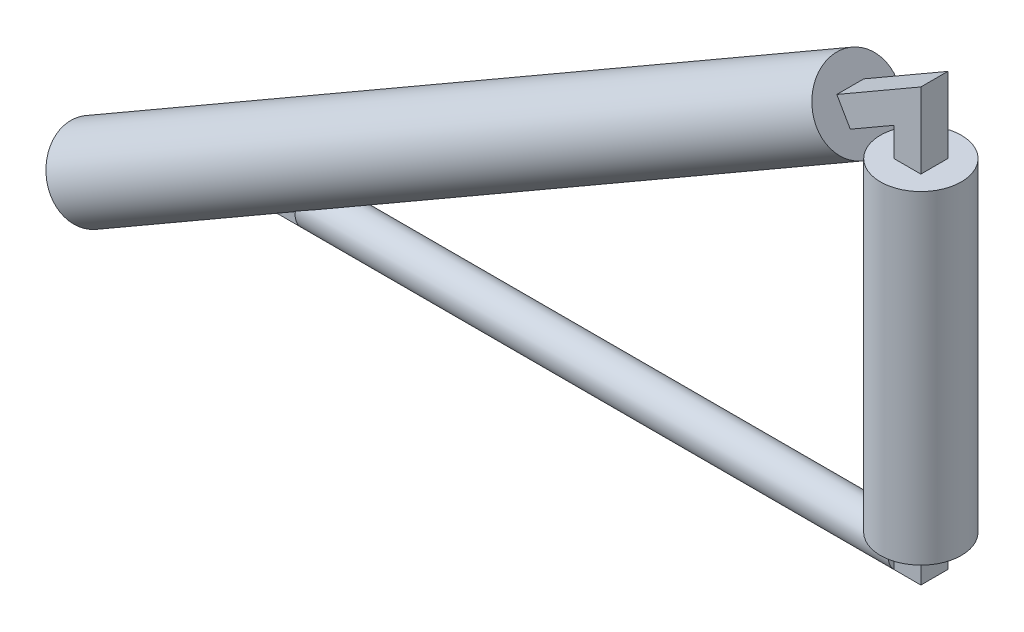
ISO-10303-21;
HEADER;
FILE_DESCRIPTION(('STEP AP214'),'2;1');
FILE_NAME('part.step','',(''),(''),'','','');
FILE_SCHEMA(('AUTOMOTIVE_DESIGN { 1 0 10303 214 1 1 1 1 }'));
ENDSEC;
DATA;
#1=APPLICATION_CONTEXT('core data for automotive mechanical design processes');
#2=APPLICATION_PROTOCOL_DEFINITION('international standard','automotive_design',2000,#1);
#3=PRODUCT_CONTEXT('',#1,'mechanical');
#4=PRODUCT('Part','Part','',(#3));
#5=PRODUCT_RELATED_PRODUCT_CATEGORY('part','',(#4));
#6=PRODUCT_DEFINITION_FORMATION('','',#4);
#7=PRODUCT_DEFINITION_CONTEXT('part definition',#1,'design');
#8=PRODUCT_DEFINITION('design','',#6,#7);
#9=PRODUCT_DEFINITION_SHAPE('','',#8);
#10=(LENGTH_UNIT() NAMED_UNIT(*) SI_UNIT(.MILLI.,.METRE.));
#11=(NAMED_UNIT(*) PLANE_ANGLE_UNIT() SI_UNIT($,.RADIAN.));
#12=(NAMED_UNIT(*) SI_UNIT($,.STERADIAN.) SOLID_ANGLE_UNIT());
#13=UNCERTAINTY_MEASURE_WITH_UNIT(LENGTH_MEASURE(1.E-05),#10,'distance_accuracy_value','');
#14=(GEOMETRIC_REPRESENTATION_CONTEXT(3) GLOBAL_UNCERTAINTY_ASSIGNED_CONTEXT((#13)) GLOBAL_UNIT_ASSIGNED_CONTEXT((#10,
#11,#12)) REPRESENTATION_CONTEXT('',''));
#15=CARTESIAN_POINT('',(0.,0.,0.));
#16=DIRECTION('',(0.,0.,1.));
#17=DIRECTION('',(1.,0.,0.));
#18=AXIS2_PLACEMENT_3D('',#15,#16,#17);
#19=CARTESIAN_POINT('',(0.,0.,3.175));
#20=DIRECTION('',(0.,0.,1.));
#21=DIRECTION('',(1.,0.,0.));
#22=AXIS2_PLACEMENT_3D('',#19,#20,#21);
#23=PLANE('',#22);
#24=DIRECTION('',(0.,-1.,0.));
#25=VECTOR('',#24,1.);
#26=CARTESIAN_POINT('',(-73.025,0.,3.175));
#27=LINE('',#26,#25);
#28=CARTESIAN_POINT('',(-73.025,1.62115619885955,3.175));
#29=VERTEX_POINT('',#28);
#30=CARTESIAN_POINT('',(-73.025,0.,3.175));
#31=VERTEX_POINT('',#30);
#32=EDGE_CURVE('E287',#29,#31,#27,.T.);
#33=ORIENTED_EDGE('',*,*,#32,.F.);
#34=DIRECTION('',(0.866025403784442,0.499999999999995,0.));
#35=VECTOR('',#34,1.);
#36=CARTESIAN_POINT('',(-97.0477418851002,-12.2483802951758,3.175));
#37=LINE('',#36,#35);
#38=CARTESIAN_POINT('',(-75.83292490343,0.,3.175));
#39=VERTEX_POINT('',#38);
#40=EDGE_CURVE('E48',#29,#39,#37,.F.);
#41=ORIENTED_EDGE('',*,*,#40,.T.);
#42=DIRECTION('',(1.,0.,0.));
#43=VECTOR('',#42,1.);
#44=CARTESIAN_POINT('',(-87.9881810244993,0.,3.175));
#45=LINE('',#44,#43);
#46=EDGE_CURVE('E267',#39,#31,#45,.T.);
#47=ORIENTED_EDGE('',*,*,#46,.T.);
#48=EDGE_LOOP('',(#33,#41,#47));
#49=FACE_BOUND('',#48,.T.);
#50=ADVANCED_FACE('F33',(#49),#23,.T.);
#51=DIRECTION('',(-0.866025403784442,-0.499999999999995,0.));
#52=VECTOR('',#51,1.);
#53=CARTESIAN_POINT('',(0.,50.7999999999995,3.175));
#54=LINE('',#53,#52);
#55=CARTESIAN_POINT('',(0.,50.7999999999995,3.175));
#56=VERTEX_POINT('',#55);
#57=CARTESIAN_POINT('',(-9.89867036525572,45.0849999999998,3.175));
#58=VERTEX_POINT('',#57);
#59=EDGE_CURVE('E249',#56,#58,#54,.T.);
#60=ORIENTED_EDGE('',*,*,#59,.T.);
#61=DIRECTION('',(0.499999999999995,-0.866025403784442,0.));
#62=VECTOR('',#61,1.);
#63=CARTESIAN_POINT('',(12.0983748908686,6.98499999999992,3.175));
#64=LINE('',#63,#62);
#65=CARTESIAN_POINT('',(-8.31117036525575,42.3353693429842,3.175));
#66=VERTEX_POINT('',#65);
#67=EDGE_CURVE('E327',#58,#66,#64,.T.);
#68=ORIENTED_EDGE('',*,*,#67,.T.);
#69=DIRECTION('',(-0.866025403784441,-0.499999999999995,0.));
#70=VECTOR('',#69,1.);
#71=CARTESIAN_POINT('',(-3.175,45.3007386859683,3.175));
#72=LINE('',#71,#70);
#73=CARTESIAN_POINT('',(-3.175,45.3007386859683,3.175));
#74=VERTEX_POINT('',#73);
#75=EDGE_CURVE('E274',#74,#66,#72,.T.);
#76=ORIENTED_EDGE('',*,*,#75,.F.);
#77=DIRECTION('',(0.,1.,0.));
#78=VECTOR('',#77,1.);
#79=CARTESIAN_POINT('',(-3.175,3.175,3.175));
#80=LINE('',#79,#78);
#81=CARTESIAN_POINT('',(-3.175,41.91,3.175));
#82=VERTEX_POINT('',#81);
#83=EDGE_CURVE('E282',#82,#74,#80,.T.);
#84=ORIENTED_EDGE('',*,*,#83,.F.);
#85=DIRECTION('',(1.,0.,0.));
#86=VECTOR('',#85,1.);
#87=CARTESIAN_POINT('',(0.,41.91,3.175));
#88=LINE('',#87,#86);
#89=CARTESIAN_POINT('',(0.,41.91,3.175));
#90=VERTEX_POINT('',#89);
#91=EDGE_CURVE('E305',#82,#90,#88,.T.);
#92=ORIENTED_EDGE('',*,*,#91,.T.);
#93=DIRECTION('',(0.,1.,0.));
#94=VECTOR('',#93,1.);
#95=CARTESIAN_POINT('',(0.,0.,3.175));
#96=LINE('',#95,#94);
#97=EDGE_CURVE('E266',#90,#56,#96,.T.);
#98=ORIENTED_EDGE('',*,*,#97,.T.);
#99=EDGE_LOOP('',(#60,#68,#76,#84,#92,#98));
#100=FACE_BOUND('',#99,.T.);
#101=ADVANCED_FACE('F356',(#100),#23,.T.);
#102=CARTESIAN_POINT('',(0.,0.,0.));
#103=DIRECTION('',(0.,0.,1.));
#104=DIRECTION('',(1.,0.,0.));
#105=AXIS2_PLACEMENT_3D('',#102,#103,#104);
#106=PLANE('',#105);
#107=DIRECTION('',(0.866025403784442,0.499999999999995,0.));
#108=VECTOR('',#107,1.);
#109=CARTESIAN_POINT('',(-97.0477418851002,-12.2483802951758,0.));
#110=LINE('',#109,#108);
#111=CARTESIAN_POINT('',(-73.025,1.62115619885955,0.));
#112=VERTEX_POINT('',#111);
#113=CARTESIAN_POINT('',(-75.83292490343,0.,0.));
#114=VERTEX_POINT('',#113);
#115=EDGE_CURVE('E173',#112,#114,#110,.F.);
#116=ORIENTED_EDGE('',*,*,#115,.F.);
#117=DIRECTION('',(0.,-1.,0.));
#118=VECTOR('',#117,1.);
#119=CARTESIAN_POINT('',(-73.025,0.,0.));
#120=LINE('',#119,#118);
#121=CARTESIAN_POINT('',(-73.025,0.,0.));
#122=VERTEX_POINT('',#121);
#123=EDGE_CURVE('E170',#112,#122,#120,.T.);
#124=ORIENTED_EDGE('',*,*,#123,.T.);
#125=DIRECTION('',(1.,0.,0.));
#126=VECTOR('',#125,1.);
#127=CARTESIAN_POINT('',(-87.9881810244993,0.,0.));
#128=LINE('',#127,#126);
#129=EDGE_CURVE('E258',#114,#122,#128,.T.);
#130=ORIENTED_EDGE('',*,*,#129,.F.);
#131=EDGE_LOOP('',(#116,#124,#130));
#132=FACE_BOUND('',#131,.T.);
#133=ADVANCED_FACE('F393',(#132),#106,.F.);
#134=DIRECTION('',(0.499999999999995,-0.866025403784442,0.));
#135=VECTOR('',#134,1.);
#136=CARTESIAN_POINT('',(12.0983748908686,6.98499999999992,0.));
#137=LINE('',#136,#135);
#138=CARTESIAN_POINT('',(-9.89867036525572,45.0849999999998,0.));
#139=VERTEX_POINT('',#138);
#140=CARTESIAN_POINT('',(-8.31117036525575,42.3353693429842,0.));
#141=VERTEX_POINT('',#140);
#142=EDGE_CURVE('E330',#139,#141,#137,.T.);
#143=ORIENTED_EDGE('',*,*,#142,.F.);
#144=DIRECTION('',(-0.866025403784442,-0.499999999999995,0.));
#145=VECTOR('',#144,1.);
#146=CARTESIAN_POINT('',(0.,50.7999999999995,0.));
#147=LINE('',#146,#145);
#148=CARTESIAN_POINT('',(0.,50.7999999999995,0.));
#149=VERTEX_POINT('',#148);
#150=EDGE_CURVE('E250',#149,#139,#147,.T.);
#151=ORIENTED_EDGE('',*,*,#150,.F.);
#152=DIRECTION('',(0.,1.,0.));
#153=VECTOR('',#152,1.);
#154=CARTESIAN_POINT('',(0.,0.,0.));
#155=LINE('',#154,#153);
#156=CARTESIAN_POINT('',(0.,41.91,0.));
#157=VERTEX_POINT('',#156);
#158=EDGE_CURVE('E257',#157,#149,#155,.T.);
#159=ORIENTED_EDGE('',*,*,#158,.F.);
#160=DIRECTION('',(1.,0.,0.));
#161=VECTOR('',#160,1.);
#162=CARTESIAN_POINT('',(0.,41.91,0.));
#163=LINE('',#162,#161);
#164=CARTESIAN_POINT('',(-3.175,41.91,0.));
#165=VERTEX_POINT('',#164);
#166=EDGE_CURVE('E308',#165,#157,#163,.T.);
#167=ORIENTED_EDGE('',*,*,#166,.F.);
#168=DIRECTION('',(0.,1.,0.));
#169=VECTOR('',#168,1.);
#170=CARTESIAN_POINT('',(-3.175,3.175,0.));
#171=LINE('',#170,#169);
#172=CARTESIAN_POINT('',(-3.175,45.3007386859683,0.));
#173=VERTEX_POINT('',#172);
#174=EDGE_CURVE('E275',#165,#173,#171,.T.);
#175=ORIENTED_EDGE('',*,*,#174,.T.);
#176=DIRECTION('',(-0.866025403784441,-0.499999999999995,0.));
#177=VECTOR('',#176,1.);
#178=CARTESIAN_POINT('',(-3.175,45.3007386859683,0.));
#179=LINE('',#178,#177);
#180=EDGE_CURVE('E276',#173,#141,#179,.T.);
#181=ORIENTED_EDGE('',*,*,#180,.T.);
#182=EDGE_LOOP('',(#143,#151,#159,#167,#175,#181));
#183=FACE_BOUND('',#182,.T.);
#184=ADVANCED_FACE('F365',(#183),#106,.F.);
#185=CARTESIAN_POINT('',(0.,50.7999999999995,3.175));
#186=DIRECTION('',(0.499999999999995,-0.866025403784442,0.));
#187=DIRECTION('',(0.866025403784442,0.499999999999995,0.));
#188=AXIS2_PLACEMENT_3D('',#185,#186,#187);
#189=PLANE('',#188);
#190=DIRECTION('',(0.,0.,-1.));
#191=VECTOR('',#190,1.);
#192=CARTESIAN_POINT('',(-9.89867036525572,45.0849999999998,3.175));
#193=LINE('',#192,#191);
#194=EDGE_CURVE('E324',#58,#139,#193,.T.);
#195=ORIENTED_EDGE('',*,*,#194,.F.);
#196=ORIENTED_EDGE('',*,*,#59,.F.);
#197=DIRECTION('',(0.,0.,-1.));
#198=VECTOR('',#197,1.);
#199=CARTESIAN_POINT('',(0.,50.7999999999995,3.175));
#200=LINE('',#199,#198);
#201=EDGE_CURVE('E246',#56,#149,#200,.T.);
#202=ORIENTED_EDGE('',*,*,#201,.T.);
#203=ORIENTED_EDGE('',*,*,#150,.T.);
#204=EDGE_LOOP('',(#195,#196,#202,#203));
#205=FACE_BOUND('',#204,.T.);
#206=ADVANCED_FACE('F354',(#205),#189,.F.);
#207=CARTESIAN_POINT('',(-3.175,45.3007386859683,3.175));
#208=DIRECTION('',(0.499999999999995,-0.866025403784441,0.));
#209=DIRECTION('',(0.866025403784442,0.499999999999995,0.));
#210=AXIS2_PLACEMENT_3D('',#207,#208,#209);
#211=PLANE('',#210);
#212=ORIENTED_EDGE('',*,*,#75,.T.);
#213=DIRECTION('',(0.,0.,-1.));
#214=VECTOR('',#213,1.);
#215=CARTESIAN_POINT('',(-8.31117036525575,42.3353693429842,3.175));
#216=LINE('',#215,#214);
#217=EDGE_CURVE('E11',#66,#141,#216,.T.);
#218=ORIENTED_EDGE('',*,*,#217,.T.);
#219=ORIENTED_EDGE('',*,*,#180,.F.);
#220=DIRECTION('',(0.,0.,-1.));
#221=VECTOR('',#220,1.);
#222=CARTESIAN_POINT('',(-3.175,45.3007386859683,3.175));
#223=LINE('',#222,#221);
#224=EDGE_CURVE('E269',#74,#173,#223,.T.);
#225=ORIENTED_EDGE('',*,*,#224,.F.);
#226=EDGE_LOOP('',(#212,#218,#219,#225));
#227=FACE_BOUND('',#226,.T.);
#228=ADVANCED_FACE('F369',(#227),#211,.T.);
#229=CARTESIAN_POINT('',(-73.025,1.5875,1.5875));
#230=DIRECTION('',(1.,0.,0.));
#231=DIRECTION('',(0.,0.,-1.));
#232=AXIS2_PLACEMENT_3D('',#229,#230,#231);
#233=CYLINDRICAL_SURFACE('',#232,2.24506403026729);
#234=CARTESIAN_POINT('',(-6.3394048812029,3.81,1.27));
#235=CARTESIAN_POINT('',(-6.34292858164266,3.8175265705742,1.32264374646897));
#236=CARTESIAN_POINT('',(-6.34558281158538,3.82317911718644,1.37561456724952));
#237=CARTESIAN_POINT('',(-6.34911314819743,3.83068637162566,1.4815582470144));
#238=CARTESIAN_POINT('',(-6.35,3.83256403026729,1.5345291235072));
#239=CARTESIAN_POINT('',(-6.35,3.83256403026729,1.6404708764928));
#240=CARTESIAN_POINT('',(-6.34911314819743,3.83068637162566,1.6934417529856));
#241=CARTESIAN_POINT('',(-6.34558281158538,3.82317911718644,1.79938543275048));
#242=CARTESIAN_POINT('',(-6.34292858164266,3.8175265705742,1.85235625353103));
#243=CARTESIAN_POINT('',(-6.3394048812029,3.81,1.905));
#244=B_SPLINE_CURVE_WITH_KNOTS('',3,(#234,#235,#236,#237,#238,#239,#240,#241,#242,#243),
.UNSPECIFIED.,.F.,.F.,(4,2,2,2,4),(0.,0.15984788962503,0.318720950210555,0.477594010796079,
0.637441900421109),.UNSPECIFIED.);
#245=CARTESIAN_POINT('',(-6.3394048812029,3.81,1.27000000000001));
#246=VERTEX_POINT('',#245);
#247=CARTESIAN_POINT('',(-6.3394048812029,3.81,1.90499999999999));
#248=VERTEX_POINT('',#247);
#249=EDGE_CURVE('E215',#246,#248,#244,.T.);
#250=ORIENTED_EDGE('',*,*,#249,.F.);
#251=DIRECTION('',(1.,0.,0.));
#252=VECTOR('',#251,1.);
#253=CARTESIAN_POINT('',(-73.025,3.81,1.27000000000001));
#254=LINE('',#253,#252);
#255=CARTESIAN_POINT('',(-3.175,3.81,1.27000000000001));
#256=VERTEX_POINT('',#255);
#257=EDGE_CURVE('E180',#246,#256,#254,.T.);
#258=ORIENTED_EDGE('',*,*,#257,.T.);
#259=CARTESIAN_POINT('',(-3.175,1.5875,1.5875));
#260=DIRECTION('',(-1.,0.,0.));
#261=DIRECTION('',(0.,-1.,0.));
#262=AXIS2_PLACEMENT_3D('',#259,#260,#261);
#263=CIRCLE('',#262,2.24506403026729);
#264=CARTESIAN_POINT('',(-3.175,3.175,0.));
#265=VERTEX_POINT('',#264);
#266=EDGE_CURVE('E230',#265,#256,#263,.F.);
#267=ORIENTED_EDGE('',*,*,#266,.F.);
#268=CARTESIAN_POINT('',(-3.175,1.5875,1.5875));
#269=DIRECTION('',(-1.,0.,0.));
#270=DIRECTION('',(0.,-1.,0.));
#271=AXIS2_PLACEMENT_3D('',#268,#269,#270);
#272=CIRCLE('',#271,2.24506403026729);
#273=CARTESIAN_POINT('',(-3.175,0.,0.));
#274=VERTEX_POINT('',#273);
#275=EDGE_CURVE('E300',#265,#274,#272,.T.);
#276=ORIENTED_EDGE('',*,*,#275,.T.);
#277=CARTESIAN_POINT('',(-3.175,0.,3.175));
#278=VERTEX_POINT('',#277);
#279=EDGE_CURVE('E301',#274,#278,#272,.T.);
#280=ORIENTED_EDGE('',*,*,#279,.T.);
#281=CARTESIAN_POINT('',(-3.175,3.175,3.175));
#282=VERTEX_POINT('',#281);
#283=EDGE_CURVE('E298',#278,#282,#272,.T.);
#284=ORIENTED_EDGE('',*,*,#283,.T.);
#285=CARTESIAN_POINT('',(-3.175,3.81,1.90499999999999));
#286=VERTEX_POINT('',#285);
#287=EDGE_CURVE('E241',#286,#282,#263,.F.);
#288=ORIENTED_EDGE('',*,*,#287,.F.);
#289=DIRECTION('',(1.,0.,0.));
#290=VECTOR('',#289,1.);
#291=CARTESIAN_POINT('',(-73.025,3.81,1.90499999999999));
#292=LINE('',#291,#290);
#293=EDGE_CURVE('E222',#286,#248,#292,.F.);
#294=ORIENTED_EDGE('',*,*,#293,.T.);
#295=EDGE_LOOP('',(#250,#258,#267,#276,#280,#284,#288,#294));
#296=FACE_BOUND('',#295,.T.);
#297=CARTESIAN_POINT('',(-73.6632899548534,1.5875,-0.657564030267288));
#298=CARTESIAN_POINT('',(-73.786389485265,1.51642830899175,-0.657564294905953));
#299=CARTESIAN_POINT('',(-73.9085952934849,1.44379137078734,-0.654202429839917));
#300=CARTESIAN_POINT('',(-74.1504941291819,1.29523938573155,-0.639710281086538));
#301=CARTESIAN_POINT('',(-74.2701881383748,1.21932565643661,-0.628583092937982));
#302=CARTESIAN_POINT('',(-74.5058014706393,1.06441478587145,-0.597201661484416));
#303=CARTESIAN_POINT('',(-74.621732288129,0.985429059488001,-0.576978716104362));
#304=CARTESIAN_POINT('',(-74.8489180020452,0.824442333621738,-0.525599324355383));
#305=CARTESIAN_POINT('',(-74.9601765457769,0.742443783453018,-0.494451590759992));
#306=CARTESIAN_POINT('',(-75.1858241113743,0.568925467636808,-0.41566712126466));
#307=CARTESIAN_POINT('',(-75.2996491561736,0.477196316927113,-0.366835560463826));
#308=CARTESIAN_POINT('',(-75.5169387452327,0.293295156858886,-0.250207265074806));
#309=CARTESIAN_POINT('',(-75.6204108576144,0.201123523386056,-0.182424523621317));
#310=CARTESIAN_POINT('',(-75.7969017155678,0.0359925322640129,-0.0382353330887216));
#311=CARTESIAN_POINT('',(-75.8721090370643,-0.0375739184961939,0.0347586398905516));
#312=CARTESIAN_POINT('',(-76.0104046777431,-0.17820549727678,0.196796939150408));
#313=CARTESIAN_POINT('',(-76.0735077863506,-0.24527850894846,0.285821417370135));
#314=CARTESIAN_POINT('',(-76.1766222045153,-0.358605455302758,0.463975180123136));
#315=CARTESIAN_POINT('',(-76.2187059801571,-0.406474476855646,0.550872023731276));
#316=CARTESIAN_POINT('',(-76.2917866875521,-0.491500656337391,0.734121740184128));
#317=CARTESIAN_POINT('',(-76.3227857561061,-0.528659878527822,0.830472785971989));
#318=CARTESIAN_POINT('',(-76.3731296315399,-0.589912635607175,1.03056937884928));
#319=CARTESIAN_POINT('',(-76.3924315815151,-0.613958091358703,1.13434057920735));
#320=CARTESIAN_POINT('',(-76.4188640919857,-0.647073249705472,1.34576666386893));
#321=CARTESIAN_POINT('',(-76.4259963774251,-0.656145074676571,1.45342099556313));
#322=CARTESIAN_POINT('',(-76.4279232652035,-0.658588832350182,1.66164700293848));
#323=CARTESIAN_POINT('',(-76.4235255352739,-0.652988553839872,1.76220138280008));
#324=CARTESIAN_POINT('',(-76.404138212042,-0.628594798476407,1.96062598567886));
#325=CARTESIAN_POINT('',(-76.3891509448221,-0.609804218991564,2.05849679326211));
#326=CARTESIAN_POINT('',(-76.348935177589,-0.56035416161034,2.24824920296481));
#327=CARTESIAN_POINT('',(-76.323774338258,-0.529773158751652,2.3401658073404));
#328=CARTESIAN_POINT('',(-76.2636491114227,-0.458530051667056,2.51654652876762));
#329=CARTESIAN_POINT('',(-76.2286836895143,-0.417866883804084,2.60100985824637));
#330=CARTESIAN_POINT('',(-76.147275344731,-0.32599302492304,2.76575130888244));
#331=CARTESIAN_POINT('',(-76.1002728547325,-0.274298369128913,2.84548052796753));
#332=CARTESIAN_POINT('',(-75.9971570944264,-0.164785870660191,2.99403539949038));
#333=CARTESIAN_POINT('',(-75.9410393213104,-0.106965006667524,3.06285562968809));
#334=CARTESIAN_POINT('',(-75.7920333065964,0.0410390550165057,3.22010254882677));
#335=CARTESIAN_POINT('',(-75.6944463937633,0.133405016987648,3.30202555999707));
#336=CARTESIAN_POINT('',(-75.4862543432109,0.320046205620001,3.44430788806964));
#337=CARTESIAN_POINT('',(-75.3756204276736,0.414325258249554,3.50461830532049));
#338=CARTESIAN_POINT('',(-75.1688277184232,0.581905819175987,3.59653822441538));
#339=CARTESIAN_POINT('',(-75.0743692482284,0.655535143032752,3.63149920123066));
#340=CARTESIAN_POINT('',(-74.8809190562747,0.80085874782562,3.69171041858434));
#341=CARTESIAN_POINT('',(-74.781924438994,0.872551745023854,3.71695435710924));
#342=CARTESIAN_POINT('',(-74.5803061118061,1.01367200802111,3.75924382584221));
#343=CARTESIAN_POINT('',(-74.4776741841186,1.08309335833569,3.77626932809594));
#344=CARTESIAN_POINT('',(-74.2697858641816,1.21937672146945,3.80326714447947));
#345=CARTESIAN_POINT('',(-74.1645284569297,1.28623771832302,3.81323668563419));
#346=CARTESIAN_POINT('',(-73.9561132066542,1.41488949144547,3.82681662449107));
#347=CARTESIAN_POINT('',(-73.8530287392175,1.47677638400692,3.83065537761919));
#348=CARTESIAN_POINT('',(-73.6454553294088,1.59828831632729,3.83336043163065));
#349=CARTESIAN_POINT('',(-73.5409661201108,1.65791291774216,3.83222577377308));
#350=CARTESIAN_POINT('',(-73.3308606857963,1.77506579564064,3.82548512327052));
#351=CARTESIAN_POINT('',(-73.2252436377057,1.83259238349768,3.81987560853256));
#352=CARTESIAN_POINT('',(-73.0132346124165,1.94564501949209,3.80454622295637));
#353=CARTESIAN_POINT('',(-72.9068425480357,2.0011708382492,3.79482588244506));
#354=CARTESIAN_POINT('',(-72.5868772132524,2.16495170324215,3.75990888814462));
#355=CARTESIAN_POINT('',(-72.3724877421662,2.2704251025872,3.72895524615997));
#356=CARTESIAN_POINT('',(-71.9433397089648,2.47482256939965,3.65265529558173));
#357=CARTESIAN_POINT('',(-71.7285814653062,2.57375072949267,3.6073180855672));
#358=CARTESIAN_POINT('',(-71.3966360526079,2.72253015493159,3.52544437779079));
#359=CARTESIAN_POINT('',(-71.2790557578647,2.77442250172107,3.4941368067205));
#360=CARTESIAN_POINT('',(-71.0445480521746,2.87649410700762,3.42667244447966));
#361=CARTESIAN_POINT('',(-70.9276205766801,2.92667353747205,3.39051614190199));
#362=CARTESIAN_POINT('',(-70.694800352758,3.02533407898319,3.31286574137432));
#363=CARTESIAN_POINT('',(-70.5789077382803,3.07381497248345,3.27137096283601));
#364=CARTESIAN_POINT('',(-70.3487424269673,3.16899754806964,3.18231419205253));
#365=CARTESIAN_POINT('',(-70.2344693393745,3.21569966408926,3.13475369201469));
#366=CARTESIAN_POINT('',(-70.0432558255458,3.29303600550512,3.04822063353518));
#367=CARTESIAN_POINT('',(-69.9656738291074,3.32418245699293,3.01112509046433));
#368=CARTESIAN_POINT('',(-69.8121151657348,3.38541657868946,2.93296495136269));
#369=CARTESIAN_POINT('',(-69.7361381367535,3.41550448872444,2.89190126236939));
#370=CARTESIAN_POINT('',(-69.5866091332761,3.47435187085724,2.80521932185234));
#371=CARTESIAN_POINT('',(-69.5130506707974,3.50311499724854,2.75961485214921));
#372=CARTESIAN_POINT('',(-69.3691144240205,3.55907804727802,2.66282374022077));
#373=CARTESIAN_POINT('',(-69.29873403515,3.58627925613259,2.61164179089287));
#374=CARTESIAN_POINT('',(-69.1751953859356,3.63378310073523,2.51242102245904));
#375=CARTESIAN_POINT('',(-69.1212517130351,3.6544339129196,2.46553787765001));
#376=CARTESIAN_POINT('',(-69.0177773174835,3.69389927939741,2.36612747286064));
#377=CARTESIAN_POINT('',(-68.968255365396,3.71271019096836,2.31358943216252));
#378=CARTESIAN_POINT('',(-68.87534082344,3.74789286398667,2.20113346574887));
#379=CARTESIAN_POINT('',(-68.8320445710254,3.76422646679306,2.14112187546569));
#380=CARTESIAN_POINT('',(-68.7563971270727,3.79269701878625,2.01367251063824));
#381=CARTESIAN_POINT('',(-68.7239955179542,3.80485330542641,1.9462709134183));
#382=CARTESIAN_POINT('',(-68.6846318647109,3.81960310284496,1.8323324639522));
#383=CARTESIAN_POINT('',(-68.6726779936682,3.82407655063908,1.78777473311633));
#384=CARTESIAN_POINT('',(-68.6559277795598,3.83034278405473,1.69714855274318));
#385=CARTESIAN_POINT('',(-68.6511240992067,3.83213831766632,1.65108170151139));
#386=CARTESIAN_POINT('',(-68.6492061487345,3.83285536283607,1.55865672244892));
#387=CARTESIAN_POINT('',(-68.652109273616,3.83177037277483,1.51229817170611));
#388=CARTESIAN_POINT('',(-68.6653015975815,3.82683639528436,1.42079200516966));
#389=CARTESIAN_POINT('',(-68.6755976708909,3.82298483539926,1.37564555699216));
#390=CARTESIAN_POINT('',(-68.7062756501972,3.81149518910549,1.27548684453244));
#391=CARTESIAN_POINT('',(-68.728653975502,3.80310653302488,1.22118061540268));
#392=CARTESIAN_POINT('',(-68.7811938106752,3.78336914700459,1.11708024644456));
#393=CARTESIAN_POINT('',(-68.8113722926657,3.77201396169768,1.06729626973644));
#394=CARTESIAN_POINT('',(-68.8996182062039,3.73872266801387,0.939897093326821));
#395=CARTESIAN_POINT('',(-68.9627126283154,3.7148358732259,0.866325061977271));
#396=CARTESIAN_POINT('',(-69.0978000325365,3.66341448930544,0.729454757540275));
#397=CARTESIAN_POINT('',(-69.1698181235652,3.6358695908436,0.666186688623297));
#398=CARTESIAN_POINT('',(-69.3452900241949,3.5683474818848,0.527098536478993));
#399=CARTESIAN_POINT('',(-69.4509539046208,3.52738246599972,0.454585633125533));
#400=CARTESIAN_POINT('',(-69.6679036763318,3.44248691923182,0.320369316873517));
#401=CARTESIAN_POINT('',(-69.7792001796576,3.39855073394751,0.258687366623649));
#402=CARTESIAN_POINT('',(-70.0058236815183,3.30816296446331,0.143543543126928));
#403=CARTESIAN_POINT('',(-70.1211698532597,3.26169860446152,0.0901299338082929));
#404=CARTESIAN_POINT('',(-70.3539614547024,3.16685168647175,-0.00958635288303157));
#405=CARTESIAN_POINT('',(-70.4714051220618,3.1184707007302,-0.0558947128468296));
#406=CARTESIAN_POINT('',(-70.716158975986,3.01637966014212,-0.145576460401544));
#407=CARTESIAN_POINT('',(-70.843575385407,2.96253564517027,-0.188504872285579));
#408=CARTESIAN_POINT('',(-71.0994465517925,2.85280269928139,-0.268280285135075));
#409=CARTESIAN_POINT('',(-71.2279015119297,2.79691336030574,-0.305126064396261));
#410=CARTESIAN_POINT('',(-71.4855352999795,2.68298045988298,-0.373276909913597));
#411=CARTESIAN_POINT('',(-71.6147148615448,2.62493414196787,-0.404574569352028));
#412=CARTESIAN_POINT('',(-71.8732527747132,2.50665062961028,-0.461839296117929));
#413=CARTESIAN_POINT('',(-72.0026111287737,2.44641340475992,-0.487806289427156));
#414=CARTESIAN_POINT('',(-72.2608782293931,2.32372924345862,-0.534427317815573));
#415=CARTESIAN_POINT('',(-72.3897873370338,2.26128749981351,-0.555092999484219));
#416=CARTESIAN_POINT('',(-72.6471045921528,2.1338737353332,-0.591070797486385));
#417=CARTESIAN_POINT('',(-72.7755127438766,2.06890173599316,-0.606382959288398));
#418=CARTESIAN_POINT('',(-73.0312784653078,1.93629339577693,-0.631328911018154));
#419=CARTESIAN_POINT('',(-73.1586372644432,1.86866095485209,-0.640970704826642));
#420=CARTESIAN_POINT('',(-73.4120687044048,1.73039184210212,-0.654088492325289));
#421=CARTESIAN_POINT('',(-73.5381411923111,1.65975481812755,-0.657563761223196));
#422=CARTESIAN_POINT('',(-73.6632899548534,1.5875,-0.657564030267288));
#423=B_SPLINE_CURVE_WITH_KNOTS('',3,(#297,#298,#299,#300,#301,#302,#303,#304,#305,#306,#307,
#308,#309,#310,#311,#312,#313,#314,#315,#316,#317,#318,#319,#320,#321,#322,#323,#324,#325,#326,
#327,#328,#329,#330,#331,#332,#333,#334,#335,#336,#337,#338,#339,#340,#341,#342,#343,#344,#345,
#346,#347,#348,#349,#350,#351,#352,#353,#354,#355,#356,#357,#358,#359,#360,#361,#362,#363,#364,
#365,#366,#367,#368,#369,#370,#371,#372,#373,#374,#375,#376,#377,#378,#379,#380,#381,#382,#383,
#384,#385,#386,#387,#388,#389,#390,#391,#392,#393,#394,#395,#396,#397,#398,#399,#400,#401,#402,
#403,#404,#405,#406,#407,#408,#409,#410,#411,#412,#413,#414,#415,#416,#417,#418,#419,#420,#421,
#422),.UNSPECIFIED.,.T.,.F.,(4,2,2,2,2,2,2,2,2,2,2,2,2,2,2,2,2,2,2,2,2,2,2,2,2,2,2,2,2,2,2,2,2,
2,2,2,2,2,2,2,2,2,2,2,2,2,2,2,2,2,2,2,2,2,2,2,2,2,2,2,2,2,4),(0.,0.426376008268394,
0.852582144647834,1.27733282116484,1.70174551648514,2.16293039451515,2.62377563904066,
3.00645888206959,3.38867152624712,3.71058296754969,4.03243232043465,4.35545387323585,
4.67842963673938,4.97939517100703,5.28029461616532,5.57922496840212,5.87818687029006,
6.19495507715225,6.51188024115102,6.98132844842782,7.45183219934826,7.82560398190474,
8.19961776844008,8.57453846487246,8.94960642250785,9.31034784960876,9.67115882108742,
10.0322540620224,10.3933905702264,11.1155710273385,11.8372955643039,12.2340532925964,
12.6307710707417,13.0275394756084,13.4242104604393,13.6985092958412,13.9727455797521,
14.2461735238454,14.5193731562438,14.7422832703679,14.9656261396058,15.1921201608168,
15.4175511171256,15.5560356036027,15.6943778837078,15.8330326809835,15.9718165716364,
16.1488117490859,16.3261953353985,16.623969351434,16.9226011100329,17.3252824376211,
17.7287529292065,18.134496306915,18.5399134710349,18.9742494082586,19.4086724765323,
19.8436712081965,20.2786759795683,20.7127167310747,21.1467537960985,21.5801767261781,
22.0136505959332),.UNSPECIFIED.);
#424=CARTESIAN_POINT('',(-73.025,1.93905747216153,3.80486777368289));
#425=VERTEX_POINT('',#424);
#426=CARTESIAN_POINT('',(-73.025,1.93905747216153,-0.629867773682885));
#427=VERTEX_POINT('',#426);
#428=EDGE_CURVE('E41',#425,#427,#423,.T.);
#429=ORIENTED_EDGE('',*,*,#428,.F.);
#430=CARTESIAN_POINT('',(-73.025,1.5875,1.5875));
#431=DIRECTION('',(-1.,0.,0.));
#432=DIRECTION('',(0.,-1.,0.));
#433=AXIS2_PLACEMENT_3D('',#430,#431,#432);
#434=CIRCLE('',#433,2.24506403026729);
#435=EDGE_CURVE('E164',#31,#425,#434,.T.);
#436=ORIENTED_EDGE('',*,*,#435,.F.);
#437=EDGE_CURVE('E160',#122,#31,#434,.T.);
#438=ORIENTED_EDGE('',*,*,#437,.F.);
#439=EDGE_CURVE('E153',#427,#122,#434,.T.);
#440=ORIENTED_EDGE('',*,*,#439,.F.);
#441=EDGE_LOOP('',(#429,#436,#438,#440));
#442=FACE_BOUND('',#441,.T.);
#443=ADVANCED_FACE('F155',(#296,#442),#233,.T.);
#444=CARTESIAN_POINT('',(0.,0.,3.175));
#445=DIRECTION('',(-1.,0.,0.));
#446=DIRECTION('',(0.,-1.,0.));
#447=AXIS2_PLACEMENT_3D('',#444,#445,#446);
#448=PLANE('',#447);
#449=DIRECTION('',(0.,0.,1.));
#450=VECTOR('',#449,1.);
#451=CARTESIAN_POINT('',(0.,41.91,3.175));
#452=LINE('',#451,#450);
#453=EDGE_CURVE('E303',#157,#90,#452,.T.);
#454=ORIENTED_EDGE('',*,*,#453,.F.);
#455=ORIENTED_EDGE('',*,*,#158,.T.);
#456=ORIENTED_EDGE('',*,*,#201,.F.);
#457=ORIENTED_EDGE('',*,*,#97,.F.);
#458=EDGE_LOOP('',(#454,#455,#456,#457));
#459=FACE_BOUND('',#458,.T.);
#460=ADVANCED_FACE('F362',(#459),#448,.F.);
#461=CARTESIAN_POINT('',(-3.175,3.175,3.175));
#462=DIRECTION('',(-1.,0.,0.));
#463=DIRECTION('',(0.,-1.,0.));
#464=AXIS2_PLACEMENT_3D('',#461,#462,#463);
#465=PLANE('',#464);
#466=DIRECTION('',(0.,0.,1.));
#467=VECTOR('',#466,1.);
#468=CARTESIAN_POINT('',(-3.175,3.81,3.175));
#469=LINE('',#468,#467);
#470=CARTESIAN_POINT('',(-3.175,3.81,0.));
#471=VERTEX_POINT('',#470);
#472=EDGE_CURVE('E238',#471,#256,#469,.T.);
#473=ORIENTED_EDGE('',*,*,#472,.F.);
#474=EDGE_CURVE('E240',#265,#471,#171,.T.);
#475=ORIENTED_EDGE('',*,*,#474,.F.);
#476=ORIENTED_EDGE('',*,*,#266,.T.);
#477=EDGE_LOOP('',(#473,#475,#476));
#478=FACE_BOUND('',#477,.T.);
#479=ADVANCED_FACE('F237',(#478),#465,.T.);
#480=ORIENTED_EDGE('',*,*,#174,.F.);
#481=DIRECTION('',(0.,0.,1.));
#482=VECTOR('',#481,1.);
#483=CARTESIAN_POINT('',(-3.175,41.91,3.175));
#484=LINE('',#483,#482);
#485=EDGE_CURVE('E178',#165,#82,#484,.T.);
#486=ORIENTED_EDGE('',*,*,#485,.T.);
#487=ORIENTED_EDGE('',*,*,#83,.T.);
#488=ORIENTED_EDGE('',*,*,#224,.T.);
#489=EDGE_LOOP('',(#480,#486,#487,#488));
#490=FACE_BOUND('',#489,.T.);
#491=ADVANCED_FACE('F373',(#490),#465,.T.);
#492=CARTESIAN_POINT('',(-87.9881810244993,0.,3.175));
#493=DIRECTION('',(0.,1.,0.));
#494=DIRECTION('',(0.,0.,1.));
#495=AXIS2_PLACEMENT_3D('',#492,#493,#494);
#496=PLANE('',#495);
#497=DIRECTION('',(0.,0.,1.));
#498=VECTOR('',#497,1.);
#499=CARTESIAN_POINT('',(-3.175,0.,3.175));
#500=LINE('',#499,#498);
#501=EDGE_CURVE('E291',#274,#278,#500,.T.);
#502=ORIENTED_EDGE('',*,*,#501,.F.);
#503=CARTESIAN_POINT('',(0.,0.,0.));
#504=VERTEX_POINT('',#503);
#505=EDGE_CURVE('E260',#274,#504,#128,.T.);
#506=ORIENTED_EDGE('',*,*,#505,.T.);
#507=DIRECTION('',(0.,0.,-1.));
#508=VECTOR('',#507,1.);
#509=CARTESIAN_POINT('',(0.,0.,3.175));
#510=LINE('',#509,#508);
#511=CARTESIAN_POINT('',(0.,0.,3.175));
#512=VERTEX_POINT('',#511);
#513=EDGE_CURVE('E242',#512,#504,#510,.T.);
#514=ORIENTED_EDGE('',*,*,#513,.F.);
#515=EDGE_CURVE('E253',#278,#512,#45,.T.);
#516=ORIENTED_EDGE('',*,*,#515,.F.);
#517=EDGE_LOOP('',(#502,#506,#514,#516));
#518=FACE_BOUND('',#517,.T.);
#519=ADVANCED_FACE('F376',(#518),#496,.F.);
#520=DIRECTION('',(1.,0.,0.));
#521=VECTOR('',#520,1.);
#522=CARTESIAN_POINT('',(0.,3.81,3.175));
#523=LINE('',#522,#521);
#524=CARTESIAN_POINT('',(-3.175,3.81,3.175));
#525=VERTEX_POINT('',#524);
#526=CARTESIAN_POINT('',(0.,3.81,3.175));
#527=VERTEX_POINT('',#526);
#528=EDGE_CURVE('E316',#525,#527,#523,.T.);
#529=ORIENTED_EDGE('',*,*,#528,.F.);
#530=EDGE_CURVE('E272',#282,#525,#80,.T.);
#531=ORIENTED_EDGE('',*,*,#530,.F.);
#532=DIRECTION('',(0.,-1.,0.));
#533=VECTOR('',#532,1.);
#534=CARTESIAN_POINT('',(-3.175,0.,3.175));
#535=LINE('',#534,#533);
#536=EDGE_CURVE('E293',#282,#278,#535,.T.);
#537=ORIENTED_EDGE('',*,*,#536,.T.);
#538=ORIENTED_EDGE('',*,*,#515,.T.);
#539=EDGE_CURVE('E263',#512,#527,#96,.T.);
#540=ORIENTED_EDGE('',*,*,#539,.T.);
#541=EDGE_LOOP('',(#529,#531,#537,#538,#540));
#542=FACE_BOUND('',#541,.T.);
#543=ADVANCED_FACE('F382',(#542),#23,.T.);
#544=ORIENTED_EDGE('',*,*,#474,.T.);
#545=DIRECTION('',(1.,0.,0.));
#546=VECTOR('',#545,1.);
#547=CARTESIAN_POINT('',(0.,3.81,0.));
#548=LINE('',#547,#546);
#549=CARTESIAN_POINT('',(0.,3.81,0.));
#550=VERTEX_POINT('',#549);
#551=EDGE_CURVE('E310',#471,#550,#548,.T.);
#552=ORIENTED_EDGE('',*,*,#551,.T.);
#553=EDGE_CURVE('E254',#504,#550,#155,.T.);
#554=ORIENTED_EDGE('',*,*,#553,.F.);
#555=ORIENTED_EDGE('',*,*,#505,.F.);
#556=DIRECTION('',(0.,-1.,0.));
#557=VECTOR('',#556,1.);
#558=CARTESIAN_POINT('',(-3.175,0.,0.));
#559=LINE('',#558,#557);
#560=EDGE_CURVE('E296',#265,#274,#559,.T.);
#561=ORIENTED_EDGE('',*,*,#560,.F.);
#562=EDGE_LOOP('',(#544,#552,#554,#555,#561));
#563=FACE_BOUND('',#562,.T.);
#564=ADVANCED_FACE('F396',(#563),#106,.F.);
#565=CARTESIAN_POINT('',(-84.8131810244993,0.,1.5875));
#566=DIRECTION('',(0.,1.,0.));
#567=DIRECTION('',(1.,0.,0.));
#568=AXIS2_PLACEMENT_3D('',#565,#566,#567);
#569=ELLIPSE('',#568,9.5250000000001,4.7625);
#570=EDGE_CURVE('E55',#114,#39,#569,.F.);
#571=ORIENTED_EDGE('',*,*,#570,.F.);
#572=ORIENTED_EDGE('',*,*,#129,.T.);
#573=DIRECTION('',(0.,0.,1.));
#574=VECTOR('',#573,1.);
#575=CARTESIAN_POINT('',(-73.025,0.,3.175));
#576=LINE('',#575,#574);
#577=EDGE_CURVE('E279',#122,#31,#576,.T.);
#578=ORIENTED_EDGE('',*,*,#577,.T.);
#579=ORIENTED_EDGE('',*,*,#46,.F.);
#580=EDGE_LOOP('',(#571,#572,#578,#579));
#581=FACE_BOUND('',#580,.T.);
#582=ADVANCED_FACE('F35',(#581),#496,.F.);
#583=ORIENTED_EDGE('',*,*,#553,.T.);
#584=DIRECTION('',(0.,0.,1.));
#585=VECTOR('',#584,1.);
#586=CARTESIAN_POINT('',(0.,3.81,3.175));
#587=LINE('',#586,#585);
#588=EDGE_CURVE('E313',#550,#527,#587,.T.);
#589=ORIENTED_EDGE('',*,*,#588,.T.);
#590=ORIENTED_EDGE('',*,*,#539,.F.);
#591=ORIENTED_EDGE('',*,*,#513,.T.);
#592=EDGE_LOOP('',(#583,#589,#590,#591));
#593=FACE_BOUND('',#592,.T.);
#594=ADVANCED_FACE('F386',(#593),#448,.F.);
#595=EDGE_CURVE('E318',#286,#525,#469,.T.);
#596=ORIENTED_EDGE('',*,*,#595,.F.);
#597=ORIENTED_EDGE('',*,*,#287,.T.);
#598=ORIENTED_EDGE('',*,*,#530,.T.);
#599=EDGE_LOOP('',(#596,#597,#598));
#600=FACE_BOUND('',#599,.T.);
#601=ADVANCED_FACE('F377',(#600),#465,.T.);
#602=CARTESIAN_POINT('',(-73.025,1.5875,1.5875));
#603=DIRECTION('',(-1.,0.,0.));
#604=DIRECTION('',(0.,-1.,0.));
#605=AXIS2_PLACEMENT_3D('',#602,#603,#604);
#606=PLANE('',#605);
#607=ORIENTED_EDGE('',*,*,#577,.F.);
#608=ORIENTED_EDGE('',*,*,#437,.T.);
#609=EDGE_LOOP('',(#607,#608));
#610=FACE_BOUND('',#609,.T.);
#611=ADVANCED_FACE('F213',(#610),#606,.T.);
#612=ORIENTED_EDGE('',*,*,#123,.F.);
#613=CARTESIAN_POINT('',(-73.025,6.80590948775059,1.5875));
#614=DIRECTION('',(-1.,0.,0.));
#615=DIRECTION('',(0.,1.,0.));
#616=AXIS2_PLACEMENT_3D('',#613,#614,#615);
#617=ELLIPSE('',#616,5.49926131403117,4.7625);
#618=EDGE_CURVE('E167',#112,#427,#617,.F.);
#619=ORIENTED_EDGE('',*,*,#618,.T.);
#620=ORIENTED_EDGE('',*,*,#439,.T.);
#621=EDGE_LOOP('',(#612,#619,#620));
#622=FACE_BOUND('',#621,.T.);
#623=ADVANCED_FACE('F168',(#622),#606,.T.);
#624=ORIENTED_EDGE('',*,*,#435,.T.);
#625=CARTESIAN_POINT('',(-73.025,6.80590948775059,1.5875));
#626=DIRECTION('',(-1.,0.,0.));
#627=DIRECTION('',(0.,1.,0.));
#628=AXIS2_PLACEMENT_3D('',#625,#626,#627);
#629=ELLIPSE('',#628,5.49926131403117,4.7625);
#630=EDGE_CURVE('E174',#425,#29,#629,.F.);
#631=ORIENTED_EDGE('',*,*,#630,.T.);
#632=ORIENTED_EDGE('',*,*,#32,.T.);
#633=EDGE_LOOP('',(#624,#631,#632));
#634=FACE_BOUND('',#633,.T.);
#635=ADVANCED_FACE('F423',(#634),#606,.T.);
#636=CARTESIAN_POINT('',(-3.175,1.5875,1.5875));
#637=DIRECTION('',(-1.,0.,0.));
#638=DIRECTION('',(0.,-1.,0.));
#639=AXIS2_PLACEMENT_3D('',#636,#637,#638);
#640=PLANE('',#639);
#641=ORIENTED_EDGE('',*,*,#279,.F.);
#642=ORIENTED_EDGE('',*,*,#501,.T.);
#643=EDGE_LOOP('',(#641,#642));
#644=FACE_BOUND('',#643,.T.);
#645=ADVANCED_FACE('F421',(#644),#640,.F.);
#646=ORIENTED_EDGE('',*,*,#275,.F.);
#647=ORIENTED_EDGE('',*,*,#560,.T.);
#648=EDGE_LOOP('',(#646,#647));
#649=FACE_BOUND('',#648,.T.);
#650=ADVANCED_FACE('F419',(#649),#640,.F.);
#651=ORIENTED_EDGE('',*,*,#536,.F.);
#652=ORIENTED_EDGE('',*,*,#283,.F.);
#653=EDGE_LOOP('',(#651,#652));
#654=FACE_BOUND('',#653,.T.);
#655=ADVANCED_FACE('F207',(#654),#640,.F.);
#656=CARTESIAN_POINT('',(-1.5875,41.91,1.5875));
#657=DIRECTION('',(0.,-1.,0.));
#658=DIRECTION('',(0.,0.,-1.));
#659=AXIS2_PLACEMENT_3D('',#656,#657,#658);
#660=PLANE('',#659);
#661=CARTESIAN_POINT('',(-1.5875,41.91,1.5875));
#662=DIRECTION('',(0.,-1.,0.));
#663=DIRECTION('',(0.,0.,-1.));
#664=AXIS2_PLACEMENT_3D('',#661,#662,#663);
#665=CIRCLE('',#664,4.7625);
#666=CARTESIAN_POINT('',(-1.5875,41.91,-3.175));
#667=VERTEX_POINT('',#666);
#668=EDGE_CURVE('E321',#667,#667,#665,.T.);
#669=ORIENTED_EDGE('',*,*,#668,.F.);
#670=EDGE_LOOP('',(#669));
#671=FACE_BOUND('',#670,.T.);
#672=ORIENTED_EDGE('',*,*,#166,.T.);
#673=ORIENTED_EDGE('',*,*,#453,.T.);
#674=ORIENTED_EDGE('',*,*,#91,.F.);
#675=ORIENTED_EDGE('',*,*,#485,.F.);
#676=EDGE_LOOP('',(#672,#673,#674,#675));
#677=FACE_BOUND('',#676,.T.);
#678=ADVANCED_FACE('F204',(#671,#677),#660,.F.);
#679=CARTESIAN_POINT('',(-1.5875,3.81,1.5875));
#680=DIRECTION('',(0.,1.,0.));
#681=DIRECTION('',(0.,0.,1.));
#682=AXIS2_PLACEMENT_3D('',#679,#680,#681);
#683=CYLINDRICAL_SURFACE('',#682,4.7625);
#684=ORIENTED_EDGE('',*,*,#668,.T.);
#685=EDGE_LOOP('',(#684));
#686=FACE_BOUND('',#685,.T.);
#687=CARTESIAN_POINT('',(-1.5875,3.81,1.5875));
#688=DIRECTION('',(0.,-1.,0.));
#689=DIRECTION('',(0.,0.,-1.));
#690=AXIS2_PLACEMENT_3D('',#687,#688,#689);
#691=CIRCLE('',#690,4.7625);
#692=EDGE_CURVE('E320',#246,#248,#691,.T.);
#693=ORIENTED_EDGE('',*,*,#692,.F.);
#694=ORIENTED_EDGE('',*,*,#249,.T.);
#695=EDGE_LOOP('',(#693,#694));
#696=FACE_BOUND('',#695,.T.);
#697=ADVANCED_FACE('F202',(#686,#696),#683,.T.);
#698=CARTESIAN_POINT('',(-1.5875,3.81,1.5875));
#699=DIRECTION('',(0.,-1.,0.));
#700=DIRECTION('',(0.,0.,-1.));
#701=AXIS2_PLACEMENT_3D('',#698,#699,#700);
#702=PLANE('',#701);
#703=ORIENTED_EDGE('',*,*,#257,.F.);
#704=ORIENTED_EDGE('',*,*,#692,.T.);
#705=ORIENTED_EDGE('',*,*,#293,.F.);
#706=ORIENTED_EDGE('',*,*,#595,.T.);
#707=ORIENTED_EDGE('',*,*,#528,.T.);
#708=ORIENTED_EDGE('',*,*,#588,.F.);
#709=ORIENTED_EDGE('',*,*,#551,.F.);
#710=ORIENTED_EDGE('',*,*,#472,.T.);
#711=EDGE_LOOP('',(#703,#704,#705,#706,#707,#708,#709,#710));
#712=FACE_BOUND('',#711,.T.);
#713=ADVANCED_FACE('F199',(#712),#702,.T.);
#714=CARTESIAN_POINT('',(-9.10492036525575,43.710184671492,1.5875));
#715=DIRECTION('',(-0.866025403784442,-0.499999999999995,0.));
#716=DIRECTION('',(0.499999999999995,-0.866025403784442,0.));
#717=AXIS2_PLACEMENT_3D('',#714,#715,#716);
#718=PLANE('',#717);
#719=CARTESIAN_POINT('',(-9.10492036525575,43.710184671492,1.5875));
#720=DIRECTION('',(-0.866025403784442,-0.499999999999995,0.));
#721=DIRECTION('',(0.499999999999995,-0.866025403784442,0.));
#722=AXIS2_PLACEMENT_3D('',#719,#720,#721);
#723=CIRCLE('',#722,4.7625);
#724=CARTESIAN_POINT('',(-6.72367036525577,39.5857386859686,1.5875));
#725=VERTEX_POINT('',#724);
#726=EDGE_CURVE('E337',#725,#725,#723,.T.);
#727=ORIENTED_EDGE('',*,*,#726,.F.);
#728=EDGE_LOOP('',(#727));
#729=FACE_BOUND('',#728,.T.);
#730=ORIENTED_EDGE('',*,*,#67,.F.);
#731=ORIENTED_EDGE('',*,*,#194,.T.);
#732=ORIENTED_EDGE('',*,*,#142,.T.);
#733=ORIENTED_EDGE('',*,*,#217,.F.);
#734=EDGE_LOOP('',(#730,#731,#732,#733));
#735=FACE_BOUND('',#734,.T.);
#736=ADVANCED_FACE('F196',(#729,#735),#718,.F.);
#737=CARTESIAN_POINT('',(-99.2928059153675,-8.35981532850747,1.5875));
#738=DIRECTION('',(0.866025403784442,0.499999999999995,0.));
#739=DIRECTION('',(-0.499999999999995,0.866025403784441,0.));
#740=AXIS2_PLACEMENT_3D('',#737,#738,#739);
#741=CYLINDRICAL_SURFACE('',#740,4.7625);
#742=CARTESIAN_POINT('',(-99.2928059153675,-8.35981532850747,1.5875));
#743=DIRECTION('',(-0.866025403784442,-0.499999999999995,0.));
#744=DIRECTION('',(0.499999999999995,-0.866025403784442,0.));
#745=AXIS2_PLACEMENT_3D('',#742,#743,#744);
#746=CIRCLE('',#745,4.7625);
#747=CARTESIAN_POINT('',(-96.9115559153675,-12.4842613140309,1.5875));
#748=VERTEX_POINT('',#747);
#749=EDGE_CURVE('E336',#748,#748,#746,.T.);
#750=ORIENTED_EDGE('',*,*,#749,.F.);
#751=EDGE_LOOP('',(#750));
#752=FACE_BOUND('',#751,.T.);
#753=ORIENTED_EDGE('',*,*,#726,.T.);
#754=EDGE_LOOP('',(#753));
#755=FACE_BOUND('',#754,.T.);
#756=ORIENTED_EDGE('',*,*,#115,.T.);
#757=ORIENTED_EDGE('',*,*,#570,.T.);
#758=ORIENTED_EDGE('',*,*,#40,.F.);
#759=ORIENTED_EDGE('',*,*,#630,.F.);
#760=ORIENTED_EDGE('',*,*,#428,.T.);
#761=ORIENTED_EDGE('',*,*,#618,.F.);
#762=EDGE_LOOP('',(#756,#757,#758,#759,#760,#761));
#763=FACE_BOUND('',#762,.T.);
#764=ADVANCED_FACE('F177',(#752,#755,#763),#741,.T.);
#765=CARTESIAN_POINT('',(-99.2928059153675,-8.35981532850747,1.5875));
#766=DIRECTION('',(-0.866025403784442,-0.499999999999995,0.));
#767=DIRECTION('',(0.499999999999995,-0.866025403784442,0.));
#768=AXIS2_PLACEMENT_3D('',#765,#766,#767);
#769=PLANE('',#768);
#770=ORIENTED_EDGE('',*,*,#749,.T.);
#771=EDGE_LOOP('',(#770));
#772=FACE_BOUND('',#771,.T.);
#773=ADVANCED_FACE('F195',(#772),#769,.T.);
#774=CLOSED_SHELL('',(#50,#101,#133,#184,#206,#228,#443,#460,#479,#491,#519,#543,#564,#582,#594,
#601,#611,#623,#635,#645,#650,#655,#678,#697,#713,#736,#764,#773));
#775=MANIFOLD_SOLID_BREP('B2',#774);
#776=ADVANCED_BREP_SHAPE_REPRESENTATION('',(#18,#775),#14);
#777=SHAPE_DEFINITION_REPRESENTATION(#9,#776);
ENDSEC;
END-ISO-10303-21;
